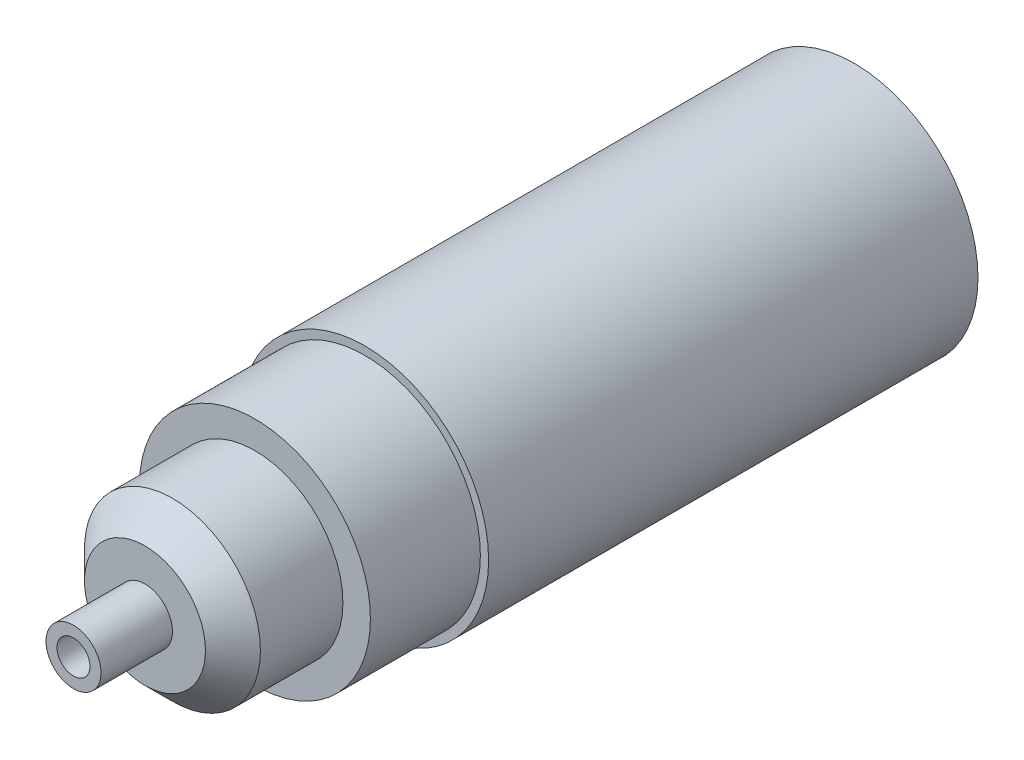
ISO-10303-21;
HEADER;
FILE_DESCRIPTION(('STEP AP214'),'2;1');
FILE_NAME('part.step','',(''),(''),'','','');
FILE_SCHEMA(('AUTOMOTIVE_DESIGN { 1 0 10303 214 1 1 1 1 }'));
ENDSEC;
DATA;
#1=APPLICATION_CONTEXT('core data for automotive mechanical design processes');
#2=APPLICATION_PROTOCOL_DEFINITION('international standard','automotive_design',2000,#1);
#3=PRODUCT_CONTEXT('',#1,'mechanical');
#4=PRODUCT('Part','Part','',(#3));
#5=PRODUCT_RELATED_PRODUCT_CATEGORY('part','',(#4));
#6=PRODUCT_DEFINITION_FORMATION('','',#4);
#7=PRODUCT_DEFINITION_CONTEXT('part definition',#1,'design');
#8=PRODUCT_DEFINITION('design','',#6,#7);
#9=PRODUCT_DEFINITION_SHAPE('','',#8);
#10=(LENGTH_UNIT() NAMED_UNIT(*) SI_UNIT(.MILLI.,.METRE.));
#11=(NAMED_UNIT(*) PLANE_ANGLE_UNIT() SI_UNIT($,.RADIAN.));
#12=(NAMED_UNIT(*) SI_UNIT($,.STERADIAN.) SOLID_ANGLE_UNIT());
#13=UNCERTAINTY_MEASURE_WITH_UNIT(LENGTH_MEASURE(1.E-05),#10,'distance_accuracy_value','');
#14=(GEOMETRIC_REPRESENTATION_CONTEXT(3) GLOBAL_UNCERTAINTY_ASSIGNED_CONTEXT((#13)) GLOBAL_UNIT_ASSIGNED_CONTEXT((#10,
#11,#12)) REPRESENTATION_CONTEXT('',''));
#15=CARTESIAN_POINT('',(0.,0.,0.));
#16=DIRECTION('',(0.,0.,1.));
#17=DIRECTION('',(1.,0.,0.));
#18=AXIS2_PLACEMENT_3D('',#15,#16,#17);
#19=CARTESIAN_POINT('',(0.,0.,89.));
#20=DIRECTION('',(0.,0.,-1.));
#21=DIRECTION('',(-1.,0.,0.));
#22=AXIS2_PLACEMENT_3D('',#19,#20,#21);
#23=CYLINDRICAL_SURFACE('',#22,22.5);
#24=CARTESIAN_POINT('',(0.,0.,89.));
#25=DIRECTION('',(0.,0.,1.));
#26=DIRECTION('',(1.,0.,0.));
#27=AXIS2_PLACEMENT_3D('',#24,#25,#26);
#28=CIRCLE('',#27,22.5);
#29=CARTESIAN_POINT('',(22.5,0.,89.));
#30=VERTEX_POINT('',#29);
#31=EDGE_CURVE('E75',#30,#30,#28,.T.);
#32=ORIENTED_EDGE('',*,*,#31,.F.);
#33=EDGE_LOOP('',(#32));
#34=FACE_BOUND('',#33,.T.);
#35=CARTESIAN_POINT('',(0.,0.,0.));
#36=DIRECTION('',(0.,0.,1.));
#37=DIRECTION('',(1.,0.,0.));
#38=AXIS2_PLACEMENT_3D('',#35,#36,#37);
#39=CIRCLE('',#38,22.5);
#40=CARTESIAN_POINT('',(22.5,0.,0.));
#41=VERTEX_POINT('',#40);
#42=EDGE_CURVE('E71',#41,#41,#39,.T.);
#43=ORIENTED_EDGE('',*,*,#42,.T.);
#44=EDGE_LOOP('',(#43));
#45=FACE_BOUND('',#44,.T.);
#46=ADVANCED_FACE('F42',(#34,#45),#23,.T.);
#47=CARTESIAN_POINT('',(0.,0.,89.));
#48=DIRECTION('',(0.,0.,1.));
#49=DIRECTION('',(1.,0.,0.));
#50=AXIS2_PLACEMENT_3D('',#47,#48,#49);
#51=PLANE('',#50);
#52=CARTESIAN_POINT('',(0.,0.,89.));
#53=DIRECTION('',(0.,0.,1.));
#54=DIRECTION('',(1.,0.,0.));
#55=AXIS2_PLACEMENT_3D('',#52,#53,#54);
#56=CIRCLE('',#55,21.);
#57=CARTESIAN_POINT('',(21.,0.,89.));
#58=VERTEX_POINT('',#57);
#59=EDGE_CURVE('E66',#58,#58,#56,.T.);
#60=ORIENTED_EDGE('',*,*,#59,.F.);
#61=EDGE_LOOP('',(#60));
#62=FACE_BOUND('',#61,.T.);
#63=ORIENTED_EDGE('',*,*,#31,.T.);
#64=EDGE_LOOP('',(#63));
#65=FACE_BOUND('',#64,.T.);
#66=ADVANCED_FACE('F102',(#62,#65),#51,.T.);
#67=CARTESIAN_POINT('',(0.,0.,0.));
#68=DIRECTION('',(0.,0.,1.));
#69=DIRECTION('',(1.,0.,0.));
#70=AXIS2_PLACEMENT_3D('',#67,#68,#69);
#71=PLANE('',#70);
#72=ORIENTED_EDGE('',*,*,#42,.F.);
#73=EDGE_LOOP('',(#72));
#74=FACE_BOUND('',#73,.T.);
#75=ADVANCED_FACE('F107',(#74),#71,.F.);
#76=CARTESIAN_POINT('',(0.,0.,109.));
#77=DIRECTION('',(0.,0.,-1.));
#78=DIRECTION('',(-1.,0.,0.));
#79=AXIS2_PLACEMENT_3D('',#76,#77,#78);
#80=CYLINDRICAL_SURFACE('',#79,21.);
#81=CARTESIAN_POINT('',(0.,0.,109.));
#82=DIRECTION('',(0.,0.,1.));
#83=DIRECTION('',(1.,0.,0.));
#84=AXIS2_PLACEMENT_3D('',#81,#82,#83);
#85=CIRCLE('',#84,21.);
#86=CARTESIAN_POINT('',(21.,0.,109.));
#87=VERTEX_POINT('',#86);
#88=EDGE_CURVE('E67',#87,#87,#85,.T.);
#89=ORIENTED_EDGE('',*,*,#88,.F.);
#90=EDGE_LOOP('',(#89));
#91=FACE_BOUND('',#90,.T.);
#92=ORIENTED_EDGE('',*,*,#59,.T.);
#93=EDGE_LOOP('',(#92));
#94=FACE_BOUND('',#93,.T.);
#95=ADVANCED_FACE('F114',(#91,#94),#80,.T.);
#96=CARTESIAN_POINT('',(0.,0.,109.));
#97=DIRECTION('',(0.,0.,1.));
#98=DIRECTION('',(1.,0.,0.));
#99=AXIS2_PLACEMENT_3D('',#96,#97,#98);
#100=PLANE('',#99);
#101=CARTESIAN_POINT('',(0.,0.,109.));
#102=DIRECTION('',(0.,0.,1.));
#103=DIRECTION('',(1.,0.,0.));
#104=AXIS2_PLACEMENT_3D('',#101,#102,#103);
#105=CIRCLE('',#104,16.);
#106=CARTESIAN_POINT('',(16.,0.,109.));
#107=VERTEX_POINT('',#106);
#108=EDGE_CURVE('E62',#107,#107,#105,.T.);
#109=ORIENTED_EDGE('',*,*,#108,.F.);
#110=EDGE_LOOP('',(#109));
#111=FACE_BOUND('',#110,.T.);
#112=ORIENTED_EDGE('',*,*,#88,.T.);
#113=EDGE_LOOP('',(#112));
#114=FACE_BOUND('',#113,.T.);
#115=ADVANCED_FACE('F119',(#111,#114),#100,.T.);
#116=CARTESIAN_POINT('',(0.,0.,129.));
#117=DIRECTION('',(0.,0.,-1.));
#118=DIRECTION('',(-1.,0.,0.));
#119=AXIS2_PLACEMENT_3D('',#116,#117,#118);
#120=CYLINDRICAL_SURFACE('',#119,16.);
#121=CARTESIAN_POINT('',(0.,0.,124.));
#122=DIRECTION('',(0.,0.,1.));
#123=DIRECTION('',(1.,0.,0.));
#124=AXIS2_PLACEMENT_3D('',#121,#122,#123);
#125=CIRCLE('',#124,16.);
#126=CARTESIAN_POINT('',(16.,0.,124.));
#127=VERTEX_POINT('',#126);
#128=EDGE_CURVE('E47',#127,#127,#125,.F.);
#129=ORIENTED_EDGE('',*,*,#128,.T.);
#130=EDGE_LOOP('',(#129));
#131=FACE_BOUND('',#130,.T.);
#132=ORIENTED_EDGE('',*,*,#108,.T.);
#133=EDGE_LOOP('',(#132));
#134=FACE_BOUND('',#133,.T.);
#135=ADVANCED_FACE('F97',(#131,#134),#120,.T.);
#136=CARTESIAN_POINT('',(0.,0.,129.));
#137=DIRECTION('',(0.,0.,1.));
#138=DIRECTION('',(1.,0.,0.));
#139=AXIS2_PLACEMENT_3D('',#136,#137,#138);
#140=PLANE('',#139);
#141=CARTESIAN_POINT('',(0.,0.,129.));
#142=DIRECTION('',(0.,0.,1.));
#143=DIRECTION('',(1.,0.,0.));
#144=AXIS2_PLACEMENT_3D('',#141,#142,#143);
#145=CIRCLE('',#144,5.);
#146=CARTESIAN_POINT('',(-5.,0.,129.));
#147=VERTEX_POINT('',#146);
#148=EDGE_CURVE('E10',#147,#147,#145,.T.);
#149=ORIENTED_EDGE('',*,*,#148,.F.);
#150=EDGE_LOOP('',(#149));
#151=FACE_BOUND('',#150,.T.);
#152=CARTESIAN_POINT('',(0.,0.,129.));
#153=DIRECTION('',(0.,0.,1.));
#154=DIRECTION('',(1.,0.,0.));
#155=AXIS2_PLACEMENT_3D('',#152,#153,#154);
#156=CIRCLE('',#155,11.);
#157=CARTESIAN_POINT('',(11.,0.,129.));
#158=VERTEX_POINT('',#157);
#159=EDGE_CURVE('E57',#158,#158,#156,.T.);
#160=ORIENTED_EDGE('',*,*,#159,.T.);
#161=EDGE_LOOP('',(#160));
#162=FACE_BOUND('',#161,.T.);
#163=ADVANCED_FACE('F85',(#151,#162),#140,.T.);
#164=CARTESIAN_POINT('',(0.,0.,129.));
#165=DIRECTION('',(0.,0.,-1.));
#166=DIRECTION('',(-1.,0.,0.));
#167=AXIS2_PLACEMENT_3D('',#164,#165,#166);
#168=CONICAL_SURFACE('',#167,11.,0.78539816339745);
#169=ORIENTED_EDGE('',*,*,#128,.F.);
#170=EDGE_LOOP('',(#169));
#171=FACE_BOUND('',#170,.T.);
#172=ORIENTED_EDGE('',*,*,#159,.F.);
#173=EDGE_LOOP('',(#172));
#174=FACE_BOUND('',#173,.T.);
#175=ADVANCED_FACE('F45',(#171,#174),#168,.T.);
#176=CARTESIAN_POINT('',(0.,0.,142.));
#177=DIRECTION('',(0.,0.,-1.));
#178=DIRECTION('',(-1.,0.,0.));
#179=AXIS2_PLACEMENT_3D('',#176,#177,#178);
#180=CYLINDRICAL_SURFACE('',#179,5.);
#181=CARTESIAN_POINT('',(0.,0.,142.));
#182=DIRECTION('',(0.,0.,1.));
#183=DIRECTION('',(1.,0.,0.));
#184=AXIS2_PLACEMENT_3D('',#181,#182,#183);
#185=CIRCLE('',#184,5.);
#186=CARTESIAN_POINT('',(-5.,0.,142.));
#187=VERTEX_POINT('',#186);
#188=EDGE_CURVE('E60',#187,#187,#185,.T.);
#189=CARTESIAN_POINT('',(-5.,0.,142.));
#190=CARTESIAN_POINT('',(-5.,0.,141.864583333333));
#191=CARTESIAN_POINT('',(-5.,0.,141.729166666667));
#192=CARTESIAN_POINT('',(-5.,0.,141.458333333333));
#193=CARTESIAN_POINT('',(-5.,0.,141.322916666667));
#194=CARTESIAN_POINT('',(-5.,0.,141.052083333333));
#195=CARTESIAN_POINT('',(-5.,0.,140.916666666667));
#196=CARTESIAN_POINT('',(-5.,0.,140.645833333333));
#197=CARTESIAN_POINT('',(-5.,0.,140.510416666667));
#198=CARTESIAN_POINT('',(-5.,0.,140.239583333333));
#199=CARTESIAN_POINT('',(-5.,0.,140.104166666667));
#200=CARTESIAN_POINT('',(-5.,0.,139.833333333333));
#201=CARTESIAN_POINT('',(-5.,0.,139.697916666667));
#202=CARTESIAN_POINT('',(-5.,0.,139.427083333333));
#203=CARTESIAN_POINT('',(-5.,0.,139.291666666667));
#204=CARTESIAN_POINT('',(-5.,0.,139.020833333333));
#205=CARTESIAN_POINT('',(-5.,0.,138.885416666667));
#206=CARTESIAN_POINT('',(-5.,0.,138.614583333333));
#207=CARTESIAN_POINT('',(-5.,0.,138.479166666667));
#208=CARTESIAN_POINT('',(-5.,0.,138.208333333333));
#209=CARTESIAN_POINT('',(-5.,0.,138.072916666667));
#210=CARTESIAN_POINT('',(-5.,0.,137.802083333333));
#211=CARTESIAN_POINT('',(-5.,0.,137.666666666667));
#212=CARTESIAN_POINT('',(-5.,0.,137.395833333333));
#213=CARTESIAN_POINT('',(-5.,0.,137.260416666667));
#214=CARTESIAN_POINT('',(-5.,0.,136.989583333333));
#215=CARTESIAN_POINT('',(-5.,0.,136.854166666667));
#216=CARTESIAN_POINT('',(-5.,0.,136.583333333333));
#217=CARTESIAN_POINT('',(-5.,0.,136.447916666667));
#218=CARTESIAN_POINT('',(-5.,0.,136.177083333333));
#219=CARTESIAN_POINT('',(-5.,0.,136.041666666667));
#220=CARTESIAN_POINT('',(-5.,0.,135.770833333333));
#221=CARTESIAN_POINT('',(-5.,0.,135.635416666667));
#222=CARTESIAN_POINT('',(-5.,0.,135.364583333333));
#223=CARTESIAN_POINT('',(-5.,0.,135.229166666667));
#224=CARTESIAN_POINT('',(-5.,0.,134.958333333333));
#225=CARTESIAN_POINT('',(-5.,0.,134.822916666667));
#226=CARTESIAN_POINT('',(-5.,0.,134.552083333333));
#227=CARTESIAN_POINT('',(-5.,0.,134.416666666667));
#228=CARTESIAN_POINT('',(-5.,0.,134.145833333333));
#229=CARTESIAN_POINT('',(-5.,0.,134.010416666667));
#230=CARTESIAN_POINT('',(-5.,0.,133.739583333333));
#231=CARTESIAN_POINT('',(-5.,0.,133.604166666667));
#232=CARTESIAN_POINT('',(-5.,0.,133.333333333333));
#233=CARTESIAN_POINT('',(-5.,0.,133.197916666667));
#234=CARTESIAN_POINT('',(-5.,0.,132.927083333333));
#235=CARTESIAN_POINT('',(-5.,0.,132.791666666667));
#236=CARTESIAN_POINT('',(-5.,0.,132.520833333333));
#237=CARTESIAN_POINT('',(-5.,0.,132.385416666667));
#238=CARTESIAN_POINT('',(-5.,0.,132.114583333333));
#239=CARTESIAN_POINT('',(-5.,0.,131.979166666667));
#240=CARTESIAN_POINT('',(-5.,0.,131.708333333333));
#241=CARTESIAN_POINT('',(-5.,0.,131.572916666667));
#242=CARTESIAN_POINT('',(-5.,0.,131.302083333333));
#243=CARTESIAN_POINT('',(-5.,0.,131.166666666667));
#244=CARTESIAN_POINT('',(-5.,0.,130.895833333333));
#245=CARTESIAN_POINT('',(-5.,0.,130.760416666667));
#246=CARTESIAN_POINT('',(-5.,0.,130.489583333333));
#247=CARTESIAN_POINT('',(-5.,0.,130.354166666667));
#248=CARTESIAN_POINT('',(-5.,0.,130.083333333333));
#249=CARTESIAN_POINT('',(-5.,0.,129.947916666667));
#250=CARTESIAN_POINT('',(-5.,0.,129.677083333333));
#251=CARTESIAN_POINT('',(-5.,0.,129.541666666667));
#252=CARTESIAN_POINT('',(-5.,0.,129.270833333333));
#253=CARTESIAN_POINT('',(-5.,0.,129.135416666667));
#254=CARTESIAN_POINT('',(-5.,0.,129.));
#255=B_SPLINE_CURVE_WITH_KNOTS('',3,(#189,#190,#191,#192,#193,#194,#195,#196,#197,#198,#199,
#200,#201,#202,#203,#204,#205,#206,#207,#208,#209,#210,#211,#212,#213,#214,#215,#216,#217,#218,
#219,#220,#221,#222,#223,#224,#225,#226,#227,#228,#229,#230,#231,#232,#233,#234,#235,#236,#237,
#238,#239,#240,#241,#242,#243,#244,#245,#246,#247,#248,#249,#250,#251,#252,#253,#254),
.UNSPECIFIED.,.F.,.F.,(4,2,2,2,2,2,2,2,2,2,2,2,2,2,2,2,2,2,2,2,2,2,2,2,2,2,2,2,2,2,2,2,4),(0.,
0.406249999999997,0.812499999999994,1.21874999999999,1.62499999999999,2.03124999999998,
2.43749999999998,2.84374999999998,3.25,3.65625,4.0625,4.46874999999999,4.87499999999999,
5.28124999999999,5.68749999999998,6.09374999999998,6.50000000000001,6.90625,7.3125,7.71875,
8.12499999999999,8.53124999999999,8.93749999999999,9.34374999999998,9.75000000000001,10.15625,
10.5625,10.96875,11.375,11.78125,12.1875,12.59375,13.),.UNSPECIFIED.);
#256=EDGE_CURVE('BSEAM88',#187,#147,#255,.T.);
#257=ORIENTED_EDGE('',*,*,#188,.F.);
#258=ORIENTED_EDGE('',*,*,#148,.T.);
#259=ORIENTED_EDGE('',*,*,#256,.T.);
#260=ORIENTED_EDGE('',*,*,#256,.F.);
#261=EDGE_LOOP('',(#257,#259,#258,#260));
#262=FACE_BOUND('',#261,.T.);
#263=ADVANCED_FACE('F88',(#262),#180,.T.);
#264=CARTESIAN_POINT('',(0.,0.,142.));
#265=DIRECTION('',(0.,0.,1.));
#266=DIRECTION('',(1.,0.,0.));
#267=AXIS2_PLACEMENT_3D('',#264,#265,#266);
#268=PLANE('',#267);
#269=CARTESIAN_POINT('',(0.,0.,142.));
#270=DIRECTION('',(0.,0.,1.));
#271=DIRECTION('',(1.,0.,0.));
#272=AXIS2_PLACEMENT_3D('',#269,#270,#271);
#273=CIRCLE('',#272,3.);
#274=CARTESIAN_POINT('',(3.,0.,142.));
#275=VERTEX_POINT('',#274);
#276=EDGE_CURVE('E143',#275,#275,#273,.T.);
#277=ORIENTED_EDGE('',*,*,#276,.F.);
#278=EDGE_LOOP('',(#277));
#279=FACE_BOUND('',#278,.T.);
#280=ORIENTED_EDGE('',*,*,#188,.T.);
#281=EDGE_LOOP('',(#280));
#282=FACE_BOUND('',#281,.T.);
#283=ADVANCED_FACE('F94',(#279,#282),#268,.T.);
#284=CARTESIAN_POINT('',(0.,0.,132.));
#285=DIRECTION('',(0.,0.,1.));
#286=DIRECTION('',(1.,0.,0.));
#287=AXIS2_PLACEMENT_3D('',#284,#285,#286);
#288=CYLINDRICAL_SURFACE('',#287,3.);
#289=CARTESIAN_POINT('',(0.,0.,132.));
#290=DIRECTION('',(0.,0.,1.));
#291=DIRECTION('',(1.,0.,0.));
#292=AXIS2_PLACEMENT_3D('',#289,#290,#291);
#293=CIRCLE('',#292,3.);
#294=CARTESIAN_POINT('',(3.,0.,132.));
#295=VERTEX_POINT('',#294);
#296=EDGE_CURVE('E141',#295,#295,#293,.T.);
#297=ORIENTED_EDGE('',*,*,#296,.F.);
#298=EDGE_LOOP('',(#297));
#299=FACE_BOUND('',#298,.T.);
#300=ORIENTED_EDGE('',*,*,#276,.T.);
#301=EDGE_LOOP('',(#300));
#302=FACE_BOUND('',#301,.T.);
#303=ADVANCED_FACE('F129',(#299,#302),#288,.F.);
#304=CARTESIAN_POINT('',(0.,0.,132.));
#305=DIRECTION('',(0.,0.,1.));
#306=DIRECTION('',(1.,0.,0.));
#307=AXIS2_PLACEMENT_3D('',#304,#305,#306);
#308=PLANE('',#307);
#309=ORIENTED_EDGE('',*,*,#296,.T.);
#310=EDGE_LOOP('',(#309));
#311=FACE_BOUND('',#310,.T.);
#312=ADVANCED_FACE('F133',(#311),#308,.T.);
#313=CLOSED_SHELL('',(#46,#66,#75,#95,#115,#135,#163,#175,#263,#283,#303,#312));
#314=MANIFOLD_SOLID_BREP('B2',#313);
#315=ADVANCED_BREP_SHAPE_REPRESENTATION('',(#18,#314),#14);
#316=SHAPE_DEFINITION_REPRESENTATION(#9,#315);
ENDSEC;
END-ISO-10303-21;
